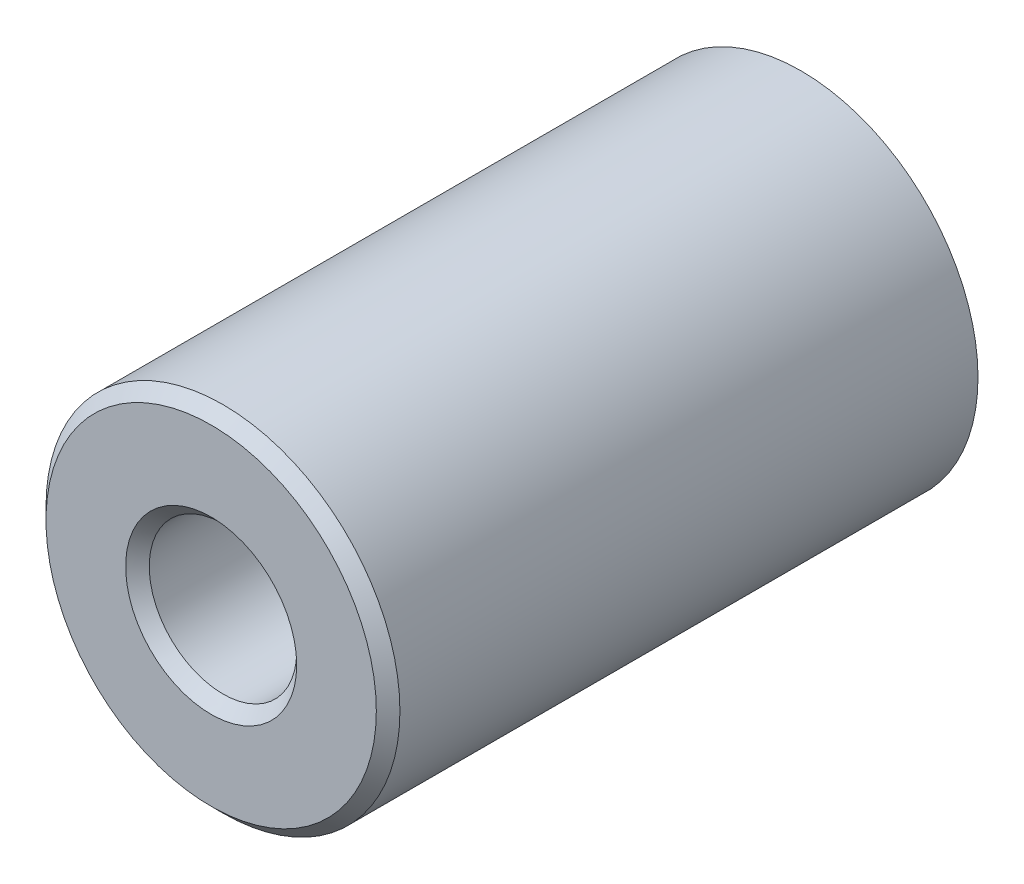
ISO-10303-21;
HEADER;
FILE_DESCRIPTION(('STEP AP214'),'2;1');
FILE_NAME('part.step','',(''),(''),'','','');
FILE_SCHEMA(('AUTOMOTIVE_DESIGN { 1 0 10303 214 1 1 1 1 }'));
ENDSEC;
DATA;
#1=APPLICATION_CONTEXT('core data for automotive mechanical design processes');
#2=APPLICATION_PROTOCOL_DEFINITION('international standard','automotive_design',2000,#1);
#3=PRODUCT_CONTEXT('',#1,'mechanical');
#4=PRODUCT('Part','Part','',(#3));
#5=PRODUCT_RELATED_PRODUCT_CATEGORY('part','',(#4));
#6=PRODUCT_DEFINITION_FORMATION('','',#4);
#7=PRODUCT_DEFINITION_CONTEXT('part definition',#1,'design');
#8=PRODUCT_DEFINITION('design','',#6,#7);
#9=PRODUCT_DEFINITION_SHAPE('','',#8);
#10=(LENGTH_UNIT() NAMED_UNIT(*) SI_UNIT(.MILLI.,.METRE.));
#11=(NAMED_UNIT(*) PLANE_ANGLE_UNIT() SI_UNIT($,.RADIAN.));
#12=(NAMED_UNIT(*) SI_UNIT($,.STERADIAN.) SOLID_ANGLE_UNIT());
#13=UNCERTAINTY_MEASURE_WITH_UNIT(LENGTH_MEASURE(1.E-05),#10,'distance_accuracy_value','');
#14=(GEOMETRIC_REPRESENTATION_CONTEXT(3) GLOBAL_UNCERTAINTY_ASSIGNED_CONTEXT((#13)) GLOBAL_UNIT_ASSIGNED_CONTEXT((#10,
#11,#12)) REPRESENTATION_CONTEXT('',''));
#15=CARTESIAN_POINT('',(0.,0.,0.));
#16=DIRECTION('',(0.,0.,1.));
#17=DIRECTION('',(1.,0.,0.));
#18=AXIS2_PLACEMENT_3D('',#15,#16,#17);
#19=CARTESIAN_POINT('',(0.,0.,10.));
#20=DIRECTION('',(0.,0.,-1.));
#21=DIRECTION('',(-1.,0.,0.));
#22=AXIS2_PLACEMENT_3D('',#19,#20,#21);
#23=CYLINDRICAL_SURFACE('',#22,3.);
#24=CARTESIAN_POINT('',(0.,0.,9.8));
#25=DIRECTION('',(0.,0.,1.));
#26=DIRECTION('',(1.,0.,0.));
#27=AXIS2_PLACEMENT_3D('',#24,#25,#26);
#28=CIRCLE('',#27,3.);
#29=CARTESIAN_POINT('',(3.,0.,9.8));
#30=VERTEX_POINT('',#29);
#31=EDGE_CURVE('E48',#30,#30,#28,.F.);
#32=ORIENTED_EDGE('',*,*,#31,.T.);
#33=EDGE_LOOP('',(#32));
#34=FACE_BOUND('',#33,.T.);
#35=CARTESIAN_POINT('',(0.,0.,0.));
#36=DIRECTION('',(0.,0.,1.));
#37=DIRECTION('',(1.,0.,0.));
#38=AXIS2_PLACEMENT_3D('',#35,#36,#37);
#39=CIRCLE('',#38,3.);
#40=CARTESIAN_POINT('',(3.,0.,0.));
#41=VERTEX_POINT('',#40);
#42=EDGE_CURVE('E59',#41,#41,#39,.T.);
#43=ORIENTED_EDGE('',*,*,#42,.T.);
#44=EDGE_LOOP('',(#43));
#45=FACE_BOUND('',#44,.T.);
#46=ADVANCED_FACE('F33',(#34,#45),#23,.T.);
#47=CARTESIAN_POINT('',(0.,0.,10.));
#48=DIRECTION('',(0.,0.,1.));
#49=DIRECTION('',(1.,0.,0.));
#50=AXIS2_PLACEMENT_3D('',#47,#48,#49);
#51=PLANE('',#50);
#52=CARTESIAN_POINT('',(0.,0.,10.));
#53=DIRECTION('',(0.,0.,1.));
#54=DIRECTION('',(1.,0.,0.));
#55=AXIS2_PLACEMENT_3D('',#52,#53,#54);
#56=CIRCLE('',#55,2.8);
#57=CARTESIAN_POINT('',(2.8,0.,10.));
#58=VERTEX_POINT('',#57);
#59=EDGE_CURVE('E53',#58,#58,#56,.T.);
#60=ORIENTED_EDGE('',*,*,#59,.T.);
#61=EDGE_LOOP('',(#60));
#62=FACE_BOUND('',#61,.T.);
#63=CARTESIAN_POINT('',(0.,0.,10.));
#64=DIRECTION('',(0.,0.,1.));
#65=DIRECTION('',(1.,0.,0.));
#66=AXIS2_PLACEMENT_3D('',#63,#64,#65);
#67=CIRCLE('',#66,1.44999999999999);
#68=CARTESIAN_POINT('',(1.44999999999999,0.,10.));
#69=VERTEX_POINT('',#68);
#70=EDGE_CURVE('E56',#69,#69,#67,.F.);
#71=ORIENTED_EDGE('',*,*,#70,.T.);
#72=EDGE_LOOP('',(#71));
#73=FACE_BOUND('',#72,.T.);
#74=ADVANCED_FACE('F67',(#62,#73),#51,.T.);
#75=CARTESIAN_POINT('',(0.,0.,0.));
#76=DIRECTION('',(0.,0.,1.));
#77=DIRECTION('',(1.,0.,0.));
#78=AXIS2_PLACEMENT_3D('',#75,#76,#77);
#79=PLANE('',#78);
#80=CARTESIAN_POINT('',(0.,0.,0.));
#81=DIRECTION('',(0.,0.,1.));
#82=DIRECTION('',(1.,0.,0.));
#83=AXIS2_PLACEMENT_3D('',#80,#81,#82);
#84=CIRCLE('',#83,1.45);
#85=CARTESIAN_POINT('',(1.45,0.,0.));
#86=VERTEX_POINT('',#85);
#87=EDGE_CURVE('E10',#86,#86,#84,.T.);
#88=ORIENTED_EDGE('',*,*,#87,.T.);
#89=EDGE_LOOP('',(#88));
#90=FACE_BOUND('',#89,.T.);
#91=ORIENTED_EDGE('',*,*,#42,.F.);
#92=EDGE_LOOP('',(#91));
#93=FACE_BOUND('',#92,.T.);
#94=ADVANCED_FACE('F64',(#90,#93),#79,.F.);
#95=CARTESIAN_POINT('',(0.,0.,10.));
#96=DIRECTION('',(0.,0.,1.));
#97=DIRECTION('',(1.,0.,0.));
#98=AXIS2_PLACEMENT_3D('',#95,#96,#97);
#99=CYLINDRICAL_SURFACE('',#98,1.24999999999999);
#100=CARTESIAN_POINT('',(0.,0.,9.8));
#101=DIRECTION('',(0.,0.,1.));
#102=DIRECTION('',(1.,0.,0.));
#103=AXIS2_PLACEMENT_3D('',#100,#101,#102);
#104=CIRCLE('',#103,1.24999999999999);
#105=CARTESIAN_POINT('',(1.24999999999999,0.,9.8));
#106=VERTEX_POINT('',#105);
#107=EDGE_CURVE('E40',#106,#106,#104,.T.);
#108=ORIENTED_EDGE('',*,*,#107,.T.);
#109=EDGE_LOOP('',(#108));
#110=FACE_BOUND('',#109,.T.);
#111=CARTESIAN_POINT('',(0.,0.,0.200000000000004));
#112=DIRECTION('',(0.,0.,1.));
#113=DIRECTION('',(1.,0.,0.));
#114=AXIS2_PLACEMENT_3D('',#111,#112,#113);
#115=CIRCLE('',#114,1.24999999999999);
#116=CARTESIAN_POINT('',(1.24999999999999,0.,0.200000000000004));
#117=VERTEX_POINT('',#116);
#118=EDGE_CURVE('E44',#117,#117,#115,.F.);
#119=ORIENTED_EDGE('',*,*,#118,.T.);
#120=EDGE_LOOP('',(#119));
#121=FACE_BOUND('',#120,.T.);
#122=ADVANCED_FACE('F66',(#110,#121),#99,.F.);
#123=CARTESIAN_POINT('',(0.,0.,10.));
#124=DIRECTION('',(0.,0.,-1.));
#125=DIRECTION('',(-1.,0.,0.));
#126=AXIS2_PLACEMENT_3D('',#123,#124,#125);
#127=CONICAL_SURFACE('',#126,2.8,0.785398163397448);
#128=ORIENTED_EDGE('',*,*,#31,.F.);
#129=EDGE_LOOP('',(#128));
#130=FACE_BOUND('',#129,.T.);
#131=ORIENTED_EDGE('',*,*,#59,.F.);
#132=EDGE_LOOP('',(#131));
#133=FACE_BOUND('',#132,.T.);
#134=ADVANCED_FACE('F73',(#130,#133),#127,.T.);
#135=CARTESIAN_POINT('',(0.,0.,9.8));
#136=DIRECTION('',(0.,0.,1.));
#137=DIRECTION('',(1.,0.,0.));
#138=AXIS2_PLACEMENT_3D('',#135,#136,#137);
#139=CONICAL_SURFACE('',#138,1.24999999999999,0.785398163397448);
#140=ORIENTED_EDGE('',*,*,#70,.F.);
#141=EDGE_LOOP('',(#140));
#142=FACE_BOUND('',#141,.T.);
#143=ORIENTED_EDGE('',*,*,#107,.F.);
#144=EDGE_LOOP('',(#143));
#145=FACE_BOUND('',#144,.T.);
#146=ADVANCED_FACE('F84',(#142,#145),#139,.F.);
#147=CARTESIAN_POINT('',(0.,0.,0.));
#148=DIRECTION('',(0.,0.,-1.));
#149=DIRECTION('',(-1.,0.,0.));
#150=AXIS2_PLACEMENT_3D('',#147,#148,#149);
#151=CONICAL_SURFACE('',#150,1.45,0.785398163397448);
#152=ORIENTED_EDGE('',*,*,#118,.F.);
#153=EDGE_LOOP('',(#152));
#154=FACE_BOUND('',#153,.T.);
#155=ORIENTED_EDGE('',*,*,#87,.F.);
#156=EDGE_LOOP('',(#155));
#157=FACE_BOUND('',#156,.T.);
#158=ADVANCED_FACE('F35',(#154,#157),#151,.F.);
#159=CLOSED_SHELL('',(#46,#74,#94,#122,#134,#146,#158));
#160=MANIFOLD_SOLID_BREP('B2',#159);
#161=ADVANCED_BREP_SHAPE_REPRESENTATION('',(#18,#160),#14);
#162=SHAPE_DEFINITION_REPRESENTATION(#9,#161);
ENDSEC;
END-ISO-10303-21;
